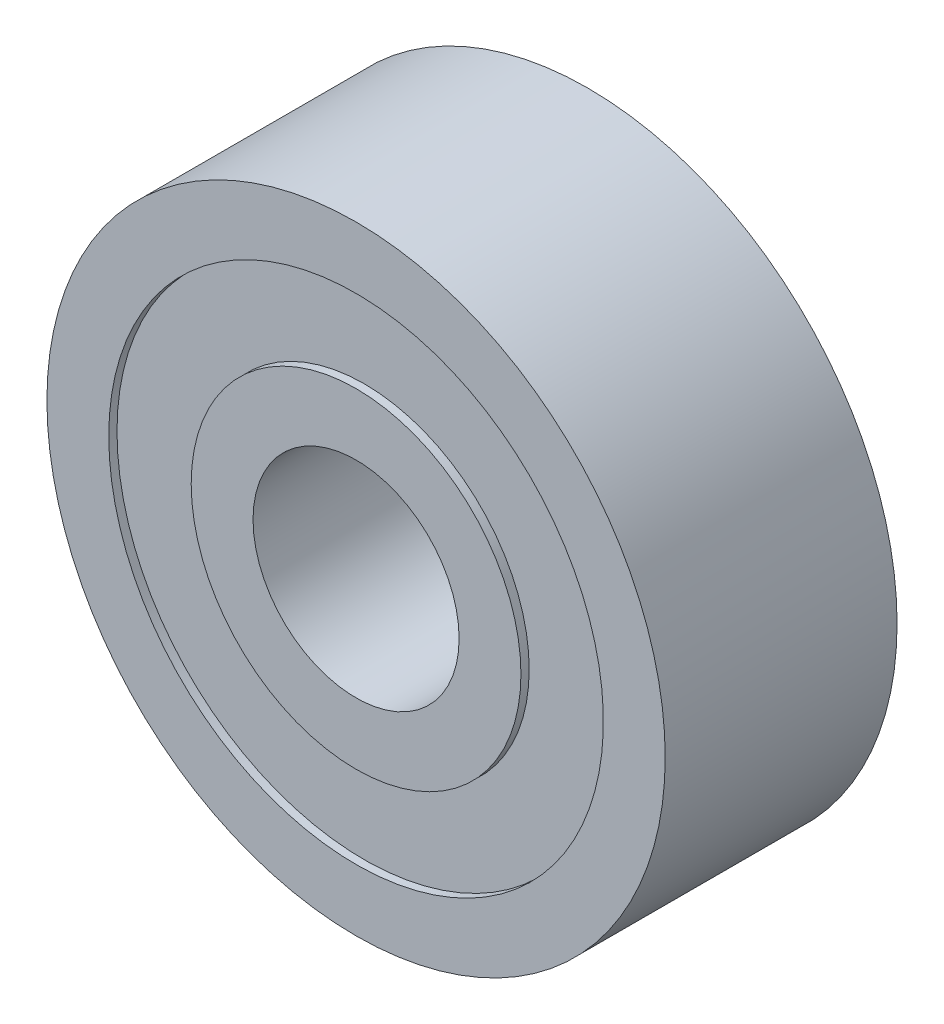
ISO-10303-21;
HEADER;
FILE_DESCRIPTION(('STEP AP214'),'2;1');
FILE_NAME('part.step','',(''),(''),'','','');
FILE_SCHEMA(('AUTOMOTIVE_DESIGN { 1 0 10303 214 1 1 1 1 }'));
ENDSEC;
DATA;
#1=APPLICATION_CONTEXT('core data for automotive mechanical design processes');
#2=APPLICATION_PROTOCOL_DEFINITION('international standard','automotive_design',2000,#1);
#3=PRODUCT_CONTEXT('',#1,'mechanical');
#4=PRODUCT('Part','Part','',(#3));
#5=PRODUCT_RELATED_PRODUCT_CATEGORY('part','',(#4));
#6=PRODUCT_DEFINITION_FORMATION('','',#4);
#7=PRODUCT_DEFINITION_CONTEXT('part definition',#1,'design');
#8=PRODUCT_DEFINITION('design','',#6,#7);
#9=PRODUCT_DEFINITION_SHAPE('','',#8);
#10=(LENGTH_UNIT() NAMED_UNIT(*) SI_UNIT(.MILLI.,.METRE.));
#11=(NAMED_UNIT(*) PLANE_ANGLE_UNIT() SI_UNIT($,.RADIAN.));
#12=(NAMED_UNIT(*) SI_UNIT($,.STERADIAN.) SOLID_ANGLE_UNIT());
#13=UNCERTAINTY_MEASURE_WITH_UNIT(LENGTH_MEASURE(1.E-05),#10,'distance_accuracy_value','');
#14=(GEOMETRIC_REPRESENTATION_CONTEXT(3) GLOBAL_UNCERTAINTY_ASSIGNED_CONTEXT((#13)) GLOBAL_UNIT_ASSIGNED_CONTEXT((#10,
#11,#12)) REPRESENTATION_CONTEXT('',''));
#15=CARTESIAN_POINT('',(0.,0.,0.));
#16=DIRECTION('',(0.,0.,1.));
#17=DIRECTION('',(1.,0.,0.));
#18=AXIS2_PLACEMENT_3D('',#15,#16,#17);
#19=CARTESIAN_POINT('',(0.,0.,-3.571875));
#20=DIRECTION('',(0.,0.,-1.));
#21=DIRECTION('',(-1.,0.,0.));
#22=AXIS2_PLACEMENT_3D('',#19,#20,#21);
#23=CYLINDRICAL_SURFACE('',#22,3.17499999999999);
#24=CARTESIAN_POINT('',(0.,0.,3.571875));
#25=DIRECTION('',(0.,0.,-1.));
#26=DIRECTION('',(-1.,0.,0.));
#27=AXIS2_PLACEMENT_3D('',#24,#25,#26);
#28=CIRCLE('',#27,3.17499999999999);
#29=CARTESIAN_POINT('',(-3.17499999999999,0.,3.571875));
#30=VERTEX_POINT('',#29);
#31=EDGE_CURVE('E17',#30,#30,#28,.F.);
#32=ORIENTED_EDGE('',*,*,#31,.T.);
#33=EDGE_LOOP('',(#32));
#34=FACE_BOUND('',#33,.T.);
#35=CARTESIAN_POINT('',(0.,0.,-3.571875));
#36=DIRECTION('',(0.,0.,-1.));
#37=DIRECTION('',(-1.,0.,0.));
#38=AXIS2_PLACEMENT_3D('',#35,#36,#37);
#39=CIRCLE('',#38,3.17499999999999);
#40=CARTESIAN_POINT('',(-3.17499999999999,0.,-3.571875));
#41=VERTEX_POINT('',#40);
#42=EDGE_CURVE('E51',#41,#41,#39,.T.);
#43=ORIENTED_EDGE('',*,*,#42,.T.);
#44=EDGE_LOOP('',(#43));
#45=FACE_BOUND('',#44,.T.);
#46=ADVANCED_FACE('F14',(#34,#45),#23,.F.);
#47=CARTESIAN_POINT('',(3.17499999999999,0.,3.571875));
#48=DIRECTION('',(0.,0.,-1.));
#49=DIRECTION('',(-1.,0.,0.));
#50=AXIS2_PLACEMENT_3D('',#47,#48,#49);
#51=PLANE('',#50);
#52=ORIENTED_EDGE('',*,*,#31,.F.);
#53=EDGE_LOOP('',(#52));
#54=FACE_BOUND('',#53,.T.);
#55=CARTESIAN_POINT('',(0.,0.,3.571875));
#56=DIRECTION('',(0.,0.,-1.));
#57=DIRECTION('',(-1.,0.,0.));
#58=AXIS2_PLACEMENT_3D('',#55,#56,#57);
#59=CIRCLE('',#58,5.08);
#60=CARTESIAN_POINT('',(-5.08,0.,3.571875));
#61=VERTEX_POINT('',#60);
#62=EDGE_CURVE('E49',#61,#61,#59,.T.);
#63=ORIENTED_EDGE('',*,*,#62,.F.);
#64=EDGE_LOOP('',(#63));
#65=FACE_BOUND('',#64,.T.);
#66=ADVANCED_FACE('F59',(#54,#65),#51,.F.);
#67=CARTESIAN_POINT('',(5.08,0.,-3.571875));
#68=DIRECTION('',(0.,0.,1.));
#69=DIRECTION('',(1.,0.,0.));
#70=AXIS2_PLACEMENT_3D('',#67,#68,#69);
#71=PLANE('',#70);
#72=CARTESIAN_POINT('',(0.,0.,-3.571875));
#73=DIRECTION('',(0.,0.,-1.));
#74=DIRECTION('',(-1.,0.,0.));
#75=AXIS2_PLACEMENT_3D('',#72,#73,#74);
#76=CIRCLE('',#75,5.08);
#77=CARTESIAN_POINT('',(-5.08,0.,-3.571875));
#78=VERTEX_POINT('',#77);
#79=EDGE_CURVE('E46',#78,#78,#76,.F.);
#80=ORIENTED_EDGE('',*,*,#79,.F.);
#81=EDGE_LOOP('',(#80));
#82=FACE_BOUND('',#81,.T.);
#83=ORIENTED_EDGE('',*,*,#42,.F.);
#84=EDGE_LOOP('',(#83));
#85=FACE_BOUND('',#84,.T.);
#86=ADVANCED_FACE('F62',(#82,#85),#71,.F.);
#87=CARTESIAN_POINT('',(0.,0.,-3.571875));
#88=DIRECTION('',(0.,0.,-1.));
#89=DIRECTION('',(-1.,0.,0.));
#90=AXIS2_PLACEMENT_3D('',#87,#88,#89);
#91=CYLINDRICAL_SURFACE('',#90,5.08);
#92=CARTESIAN_POINT('',(0.,0.,3.317875));
#93=DIRECTION('',(0.,0.,-1.));
#94=DIRECTION('',(-1.,0.,0.));
#95=AXIS2_PLACEMENT_3D('',#92,#93,#94);
#96=CIRCLE('',#95,5.08);
#97=CARTESIAN_POINT('',(-5.08,0.,3.317875));
#98=VERTEX_POINT('',#97);
#99=EDGE_CURVE('E43',#98,#98,#96,.F.);
#100=ORIENTED_EDGE('',*,*,#99,.T.);
#101=EDGE_LOOP('',(#100));
#102=FACE_BOUND('',#101,.T.);
#103=ORIENTED_EDGE('',*,*,#62,.T.);
#104=EDGE_LOOP('',(#103));
#105=FACE_BOUND('',#104,.T.);
#106=ADVANCED_FACE('F65',(#102,#105),#91,.T.);
#107=CARTESIAN_POINT('',(0.,0.,-3.571875));
#108=DIRECTION('',(0.,0.,-1.));
#109=DIRECTION('',(-1.,0.,0.));
#110=AXIS2_PLACEMENT_3D('',#107,#108,#109);
#111=CYLINDRICAL_SURFACE('',#110,5.08);
#112=ORIENTED_EDGE('',*,*,#79,.T.);
#113=EDGE_LOOP('',(#112));
#114=FACE_BOUND('',#113,.T.);
#115=CARTESIAN_POINT('',(0.,0.,-3.317875));
#116=DIRECTION('',(0.,0.,-1.));
#117=DIRECTION('',(-1.,0.,0.));
#118=AXIS2_PLACEMENT_3D('',#115,#116,#117);
#119=CIRCLE('',#118,5.08);
#120=CARTESIAN_POINT('',(-5.08,0.,-3.317875));
#121=VERTEX_POINT('',#120);
#122=EDGE_CURVE('E40',#121,#121,#119,.T.);
#123=ORIENTED_EDGE('',*,*,#122,.T.);
#124=EDGE_LOOP('',(#123));
#125=FACE_BOUND('',#124,.T.);
#126=ADVANCED_FACE('F67',(#114,#125),#111,.T.);
#127=CARTESIAN_POINT('',(5.08,0.,3.317875));
#128=DIRECTION('',(0.,0.,-1.));
#129=DIRECTION('',(-1.,0.,0.));
#130=AXIS2_PLACEMENT_3D('',#127,#128,#129);
#131=PLANE('',#130);
#132=ORIENTED_EDGE('',*,*,#99,.F.);
#133=EDGE_LOOP('',(#132));
#134=FACE_BOUND('',#133,.T.);
#135=CARTESIAN_POINT('',(0.,0.,3.317875));
#136=DIRECTION('',(0.,0.,-1.));
#137=DIRECTION('',(-1.,0.,0.));
#138=AXIS2_PLACEMENT_3D('',#135,#136,#137);
#139=CIRCLE('',#138,7.62);
#140=CARTESIAN_POINT('',(-7.62,0.,3.317875));
#141=VERTEX_POINT('',#140);
#142=EDGE_CURVE('E37',#141,#141,#139,.F.);
#143=ORIENTED_EDGE('',*,*,#142,.T.);
#144=EDGE_LOOP('',(#143));
#145=FACE_BOUND('',#144,.T.);
#146=ADVANCED_FACE('F75',(#134,#145),#131,.F.);
#147=CARTESIAN_POINT('',(7.62,0.,-3.317875));
#148=DIRECTION('',(0.,0.,1.));
#149=DIRECTION('',(1.,0.,0.));
#150=AXIS2_PLACEMENT_3D('',#147,#148,#149);
#151=PLANE('',#150);
#152=CARTESIAN_POINT('',(0.,0.,-3.317875));
#153=DIRECTION('',(0.,0.,-1.));
#154=DIRECTION('',(-1.,0.,0.));
#155=AXIS2_PLACEMENT_3D('',#152,#153,#154);
#156=CIRCLE('',#155,7.62);
#157=CARTESIAN_POINT('',(-7.62,0.,-3.317875));
#158=VERTEX_POINT('',#157);
#159=EDGE_CURVE('E34',#158,#158,#156,.T.);
#160=ORIENTED_EDGE('',*,*,#159,.T.);
#161=EDGE_LOOP('',(#160));
#162=FACE_BOUND('',#161,.T.);
#163=ORIENTED_EDGE('',*,*,#122,.F.);
#164=EDGE_LOOP('',(#163));
#165=FACE_BOUND('',#164,.T.);
#166=ADVANCED_FACE('F102',(#162,#165),#151,.F.);
#167=CARTESIAN_POINT('',(0.,0.,-3.571875));
#168=DIRECTION('',(0.,0.,-1.));
#169=DIRECTION('',(-1.,0.,0.));
#170=AXIS2_PLACEMENT_3D('',#167,#168,#169);
#171=CYLINDRICAL_SURFACE('',#170,7.62);
#172=CARTESIAN_POINT('',(0.,0.,3.571875));
#173=DIRECTION('',(0.,0.,-1.));
#174=DIRECTION('',(-1.,0.,0.));
#175=AXIS2_PLACEMENT_3D('',#172,#173,#174);
#176=CIRCLE('',#175,7.62);
#177=CARTESIAN_POINT('',(-7.62,0.,3.571875));
#178=VERTEX_POINT('',#177);
#179=EDGE_CURVE('E31',#178,#178,#176,.F.);
#180=ORIENTED_EDGE('',*,*,#179,.T.);
#181=EDGE_LOOP('',(#180));
#182=FACE_BOUND('',#181,.T.);
#183=ORIENTED_EDGE('',*,*,#142,.F.);
#184=EDGE_LOOP('',(#183));
#185=FACE_BOUND('',#184,.T.);
#186=ADVANCED_FACE('F98',(#182,#185),#171,.F.);
#187=CARTESIAN_POINT('',(0.,0.,-3.571875));
#188=DIRECTION('',(0.,0.,-1.));
#189=DIRECTION('',(-1.,0.,0.));
#190=AXIS2_PLACEMENT_3D('',#187,#188,#189);
#191=CYLINDRICAL_SURFACE('',#190,7.62);
#192=ORIENTED_EDGE('',*,*,#159,.F.);
#193=EDGE_LOOP('',(#192));
#194=FACE_BOUND('',#193,.T.);
#195=CARTESIAN_POINT('',(0.,0.,-3.571875));
#196=DIRECTION('',(0.,0.,-1.));
#197=DIRECTION('',(-1.,0.,0.));
#198=AXIS2_PLACEMENT_3D('',#195,#196,#197);
#199=CIRCLE('',#198,7.62);
#200=CARTESIAN_POINT('',(-7.62,0.,-3.571875));
#201=VERTEX_POINT('',#200);
#202=EDGE_CURVE('E26',#201,#201,#199,.T.);
#203=ORIENTED_EDGE('',*,*,#202,.T.);
#204=EDGE_LOOP('',(#203));
#205=FACE_BOUND('',#204,.T.);
#206=ADVANCED_FACE('F94',(#194,#205),#191,.F.);
#207=CARTESIAN_POINT('',(7.62,0.,3.571875));
#208=DIRECTION('',(0.,0.,-1.));
#209=DIRECTION('',(-1.,0.,0.));
#210=AXIS2_PLACEMENT_3D('',#207,#208,#209);
#211=PLANE('',#210);
#212=ORIENTED_EDGE('',*,*,#179,.F.);
#213=EDGE_LOOP('',(#212));
#214=FACE_BOUND('',#213,.T.);
#215=CARTESIAN_POINT('',(0.,0.,3.571875));
#216=DIRECTION('',(0.,0.,-1.));
#217=DIRECTION('',(-1.,0.,0.));
#218=AXIS2_PLACEMENT_3D('',#215,#216,#217);
#219=CIRCLE('',#218,9.525);
#220=CARTESIAN_POINT('',(-9.525,0.,3.571875));
#221=VERTEX_POINT('',#220);
#222=EDGE_CURVE('E21',#221,#221,#219,.T.);
#223=ORIENTED_EDGE('',*,*,#222,.F.);
#224=EDGE_LOOP('',(#223));
#225=FACE_BOUND('',#224,.T.);
#226=ADVANCED_FACE('F87',(#214,#225),#211,.F.);
#227=CARTESIAN_POINT('',(9.525,0.,-3.571875));
#228=DIRECTION('',(0.,0.,1.));
#229=DIRECTION('',(1.,0.,0.));
#230=AXIS2_PLACEMENT_3D('',#227,#228,#229);
#231=PLANE('',#230);
#232=CARTESIAN_POINT('',(0.,0.,-3.571875));
#233=DIRECTION('',(0.,0.,-1.));
#234=DIRECTION('',(-1.,0.,0.));
#235=AXIS2_PLACEMENT_3D('',#232,#233,#234);
#236=CIRCLE('',#235,9.525);
#237=CARTESIAN_POINT('',(-9.525,0.,-3.571875));
#238=VERTEX_POINT('',#237);
#239=EDGE_CURVE('E10',#238,#238,#236,.F.);
#240=ORIENTED_EDGE('',*,*,#239,.F.);
#241=EDGE_LOOP('',(#240));
#242=FACE_BOUND('',#241,.T.);
#243=ORIENTED_EDGE('',*,*,#202,.F.);
#244=EDGE_LOOP('',(#243));
#245=FACE_BOUND('',#244,.T.);
#246=ADVANCED_FACE('F82',(#242,#245),#231,.F.);
#247=CARTESIAN_POINT('',(0.,0.,-3.571875));
#248=DIRECTION('',(0.,0.,-1.));
#249=DIRECTION('',(-1.,0.,0.));
#250=AXIS2_PLACEMENT_3D('',#247,#248,#249);
#251=CYLINDRICAL_SURFACE('',#250,9.525);
#252=ORIENTED_EDGE('',*,*,#239,.T.);
#253=EDGE_LOOP('',(#252));
#254=FACE_BOUND('',#253,.T.);
#255=ORIENTED_EDGE('',*,*,#222,.T.);
#256=EDGE_LOOP('',(#255));
#257=FACE_BOUND('',#256,.T.);
#258=ADVANCED_FACE('F80',(#254,#257),#251,.T.);
#259=CLOSED_SHELL('',(#46,#66,#86,#106,#126,#146,#166,#186,#206,#226,#246,#258));
#260=MANIFOLD_SOLID_BREP('B1',#259);
#261=ADVANCED_BREP_SHAPE_REPRESENTATION('',(#18,#260),#14);
#262=SHAPE_DEFINITION_REPRESENTATION(#9,#261);
ENDSEC;
END-ISO-10303-21;
